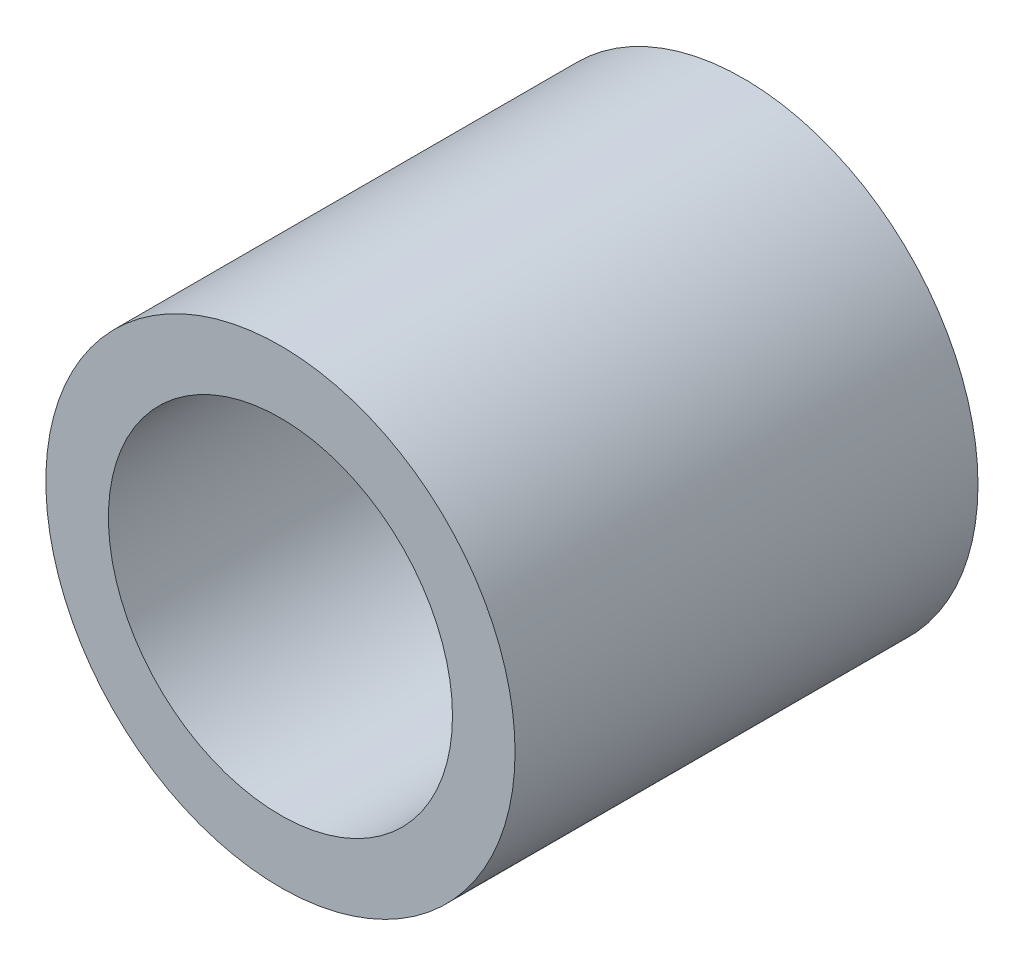
ISO-10303-21;
HEADER;
FILE_DESCRIPTION(('STEP AP214'),'2;1');
FILE_NAME('part.step','',(''),(''),'','','');
FILE_SCHEMA(('AUTOMOTIVE_DESIGN { 1 0 10303 214 1 1 1 1 }'));
ENDSEC;
DATA;
#1=APPLICATION_CONTEXT('core data for automotive mechanical design processes');
#2=APPLICATION_PROTOCOL_DEFINITION('international standard','automotive_design',2000,#1);
#3=PRODUCT_CONTEXT('',#1,'mechanical');
#4=PRODUCT('Part','Part','',(#3));
#5=PRODUCT_RELATED_PRODUCT_CATEGORY('part','',(#4));
#6=PRODUCT_DEFINITION_FORMATION('','',#4);
#7=PRODUCT_DEFINITION_CONTEXT('part definition',#1,'design');
#8=PRODUCT_DEFINITION('design','',#6,#7);
#9=PRODUCT_DEFINITION_SHAPE('','',#8);
#10=(LENGTH_UNIT() NAMED_UNIT(*) SI_UNIT(.MILLI.,.METRE.));
#11=(NAMED_UNIT(*) PLANE_ANGLE_UNIT() SI_UNIT($,.RADIAN.));
#12=(NAMED_UNIT(*) SI_UNIT($,.STERADIAN.) SOLID_ANGLE_UNIT());
#13=UNCERTAINTY_MEASURE_WITH_UNIT(LENGTH_MEASURE(1.E-05),#10,'distance_accuracy_value','');
#14=(GEOMETRIC_REPRESENTATION_CONTEXT(3) GLOBAL_UNCERTAINTY_ASSIGNED_CONTEXT((#13)) GLOBAL_UNIT_ASSIGNED_CONTEXT((#10,
#11,#12)) REPRESENTATION_CONTEXT('',''));
#15=CARTESIAN_POINT('',(0.,0.,0.));
#16=DIRECTION('',(0.,0.,1.));
#17=DIRECTION('',(1.,0.,0.));
#18=AXIS2_PLACEMENT_3D('',#15,#16,#17);
#19=CARTESIAN_POINT('',(-4.97633536173073,-25.8000000000002,-1.50000000000001));
#20=DIRECTION('',(0.,0.,1.));
#21=DIRECTION('',(1.,0.,0.));
#22=AXIS2_PLACEMENT_3D('',#19,#20,#21);
#23=CYLINDRICAL_SURFACE('',#22,15.);
#24=CARTESIAN_POINT('',(-4.97633536173073,-25.8000000000002,-1.50000000000001));
#25=DIRECTION('',(0.,0.,1.));
#26=DIRECTION('',(1.,0.,0.));
#27=AXIS2_PLACEMENT_3D('',#24,#25,#26);
#28=CIRCLE('',#27,15.);
#29=CARTESIAN_POINT('',(10.0236646382693,-25.8000000000002,-1.50000000000001));
#30=VERTEX_POINT('',#29);
#31=EDGE_CURVE('E10',#30,#30,#28,.T.);
#32=ORIENTED_EDGE('',*,*,#31,.T.);
#33=EDGE_LOOP('',(#32));
#34=FACE_BOUND('',#33,.T.);
#35=CARTESIAN_POINT('',(-4.97633536173073,-25.8000000000002,28.1));
#36=DIRECTION('',(0.,0.,1.));
#37=DIRECTION('',(1.,0.,0.));
#38=AXIS2_PLACEMENT_3D('',#35,#36,#37);
#39=CIRCLE('',#38,15.);
#40=CARTESIAN_POINT('',(10.0236646382693,-25.8000000000002,28.1));
#41=VERTEX_POINT('',#40);
#42=EDGE_CURVE('E34',#41,#41,#39,.T.);
#43=ORIENTED_EDGE('',*,*,#42,.F.);
#44=EDGE_LOOP('',(#43));
#45=FACE_BOUND('',#44,.T.);
#46=ADVANCED_FACE('F31',(#34,#45),#23,.T.);
#47=CARTESIAN_POINT('',(-4.97633536173073,-25.8000000000002,-1.50000000000001));
#48=DIRECTION('',(0.,0.,1.));
#49=DIRECTION('',(1.,0.,0.));
#50=AXIS2_PLACEMENT_3D('',#47,#48,#49);
#51=PLANE('',#50);
#52=CARTESIAN_POINT('',(-4.97633536173073,-25.8000000000002,-1.50000000000001));
#53=DIRECTION('',(0.,0.,1.));
#54=DIRECTION('',(1.,0.,0.));
#55=AXIS2_PLACEMENT_3D('',#52,#53,#54);
#56=CIRCLE('',#55,11.);
#57=CARTESIAN_POINT('',(6.02366463826927,-25.8000000000002,-1.50000000000001));
#58=VERTEX_POINT('',#57);
#59=EDGE_CURVE('E41',#58,#58,#56,.T.);
#60=ORIENTED_EDGE('',*,*,#59,.T.);
#61=EDGE_LOOP('',(#60));
#62=FACE_BOUND('',#61,.T.);
#63=ORIENTED_EDGE('',*,*,#31,.F.);
#64=EDGE_LOOP('',(#63));
#65=FACE_BOUND('',#64,.T.);
#66=ADVANCED_FACE('F49',(#62,#65),#51,.F.);
#67=CARTESIAN_POINT('',(-4.97633536173073,-25.8000000000002,28.1));
#68=DIRECTION('',(0.,0.,1.));
#69=DIRECTION('',(1.,0.,0.));
#70=AXIS2_PLACEMENT_3D('',#67,#68,#69);
#71=PLANE('',#70);
#72=CARTESIAN_POINT('',(-4.97633536173073,-25.8000000000002,28.1));
#73=DIRECTION('',(0.,0.,1.));
#74=DIRECTION('',(1.,0.,0.));
#75=AXIS2_PLACEMENT_3D('',#72,#73,#74);
#76=CIRCLE('',#75,11.);
#77=CARTESIAN_POINT('',(6.02366463826927,-25.8000000000002,28.1));
#78=VERTEX_POINT('',#77);
#79=EDGE_CURVE('E43',#78,#78,#76,.T.);
#80=ORIENTED_EDGE('',*,*,#79,.F.);
#81=EDGE_LOOP('',(#80));
#82=FACE_BOUND('',#81,.T.);
#83=ORIENTED_EDGE('',*,*,#42,.T.);
#84=EDGE_LOOP('',(#83));
#85=FACE_BOUND('',#84,.T.);
#86=ADVANCED_FACE('F55',(#82,#85),#71,.T.);
#87=CARTESIAN_POINT('',(-4.97633536173073,-25.8000000000002,-1.50000000000001));
#88=DIRECTION('',(0.,0.,1.));
#89=DIRECTION('',(1.,0.,0.));
#90=AXIS2_PLACEMENT_3D('',#87,#88,#89);
#91=CYLINDRICAL_SURFACE('',#90,11.);
#92=ORIENTED_EDGE('',*,*,#59,.F.);
#93=EDGE_LOOP('',(#92));
#94=FACE_BOUND('',#93,.T.);
#95=ORIENTED_EDGE('',*,*,#79,.T.);
#96=EDGE_LOOP('',(#95));
#97=FACE_BOUND('',#96,.T.);
#98=ADVANCED_FACE('F52',(#94,#97),#91,.F.);
#99=CLOSED_SHELL('',(#46,#66,#86,#98));
#100=MANIFOLD_SOLID_BREP('B2',#99);
#101=ADVANCED_BREP_SHAPE_REPRESENTATION('',(#18,#100),#14);
#102=SHAPE_DEFINITION_REPRESENTATION(#9,#101);
ENDSEC;
END-ISO-10303-21;
